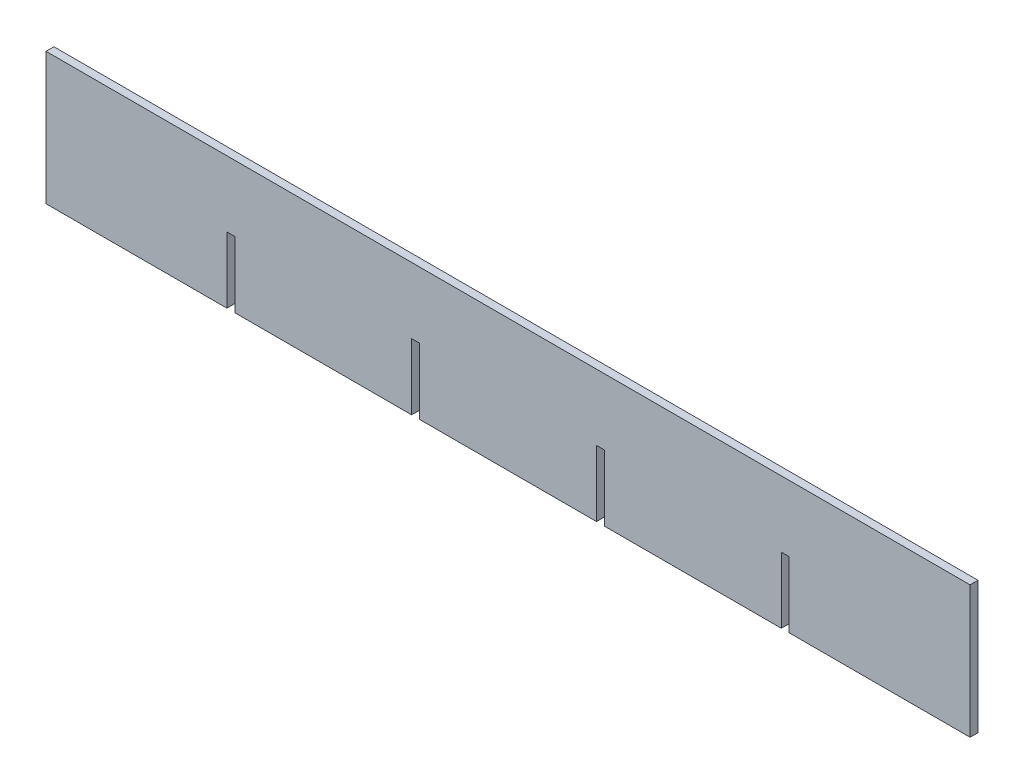
ISO-10303-21;
HEADER;
FILE_DESCRIPTION(('STEP AP214'),'2;1');
FILE_NAME('part.step','',(''),(''),'','','');
FILE_SCHEMA(('AUTOMOTIVE_DESIGN { 1 0 10303 214 1 1 1 1 }'));
ENDSEC;
DATA;
#1=APPLICATION_CONTEXT('core data for automotive mechanical design processes');
#2=APPLICATION_PROTOCOL_DEFINITION('international standard','automotive_design',2000,#1);
#3=PRODUCT_CONTEXT('',#1,'mechanical');
#4=PRODUCT('Part','Part','',(#3));
#5=PRODUCT_RELATED_PRODUCT_CATEGORY('part','',(#4));
#6=PRODUCT_DEFINITION_FORMATION('','',#4);
#7=PRODUCT_DEFINITION_CONTEXT('part definition',#1,'design');
#8=PRODUCT_DEFINITION('design','',#6,#7);
#9=PRODUCT_DEFINITION_SHAPE('','',#8);
#10=(LENGTH_UNIT() NAMED_UNIT(*) SI_UNIT(.MILLI.,.METRE.));
#11=(NAMED_UNIT(*) PLANE_ANGLE_UNIT() SI_UNIT($,.RADIAN.));
#12=(NAMED_UNIT(*) SI_UNIT($,.STERADIAN.) SOLID_ANGLE_UNIT());
#13=UNCERTAINTY_MEASURE_WITH_UNIT(LENGTH_MEASURE(1.E-05),#10,'distance_accuracy_value','');
#14=(GEOMETRIC_REPRESENTATION_CONTEXT(3) GLOBAL_UNCERTAINTY_ASSIGNED_CONTEXT((#13)) GLOBAL_UNIT_ASSIGNED_CONTEXT((#10,
#11,#12)) REPRESENTATION_CONTEXT('',''));
#15=CARTESIAN_POINT('',(0.,0.,0.));
#16=DIRECTION('',(0.,0.,1.));
#17=DIRECTION('',(1.,0.,0.));
#18=AXIS2_PLACEMENT_3D('',#15,#16,#17);
#19=CARTESIAN_POINT('',(281.5,0.,3.));
#20=DIRECTION('',(-1.,0.,0.));
#21=DIRECTION('',(0.,0.,1.));
#22=AXIS2_PLACEMENT_3D('',#19,#20,#21);
#23=PLANE('',#22);
#24=DIRECTION('',(0.,1.,0.));
#25=VECTOR('',#24,1.);
#26=CARTESIAN_POINT('',(281.5,0.,0.));
#27=LINE('',#26,#25);
#28=CARTESIAN_POINT('',(281.5,0.,0.));
#29=VERTEX_POINT('',#28);
#30=CARTESIAN_POINT('',(281.5,25.,0.));
#31=VERTEX_POINT('',#30);
#32=EDGE_CURVE('E206',#29,#31,#27,.T.);
#33=ORIENTED_EDGE('',*,*,#32,.F.);
#34=DIRECTION('',(0.,0.,-1.));
#35=VECTOR('',#34,1.);
#36=CARTESIAN_POINT('',(281.5,0.,3.));
#37=LINE('',#36,#35);
#38=CARTESIAN_POINT('',(281.5,0.,3.));
#39=VERTEX_POINT('',#38);
#40=EDGE_CURVE('E11',#39,#29,#37,.T.);
#41=ORIENTED_EDGE('',*,*,#40,.F.);
#42=DIRECTION('',(0.,1.,0.));
#43=VECTOR('',#42,1.);
#44=CARTESIAN_POINT('',(281.5,0.,3.));
#45=LINE('',#44,#43);
#46=CARTESIAN_POINT('',(281.5,25.,3.));
#47=VERTEX_POINT('',#46);
#48=EDGE_CURVE('E250',#39,#47,#45,.T.);
#49=ORIENTED_EDGE('',*,*,#48,.T.);
#50=DIRECTION('',(0.,0.,-1.));
#51=VECTOR('',#50,1.);
#52=CARTESIAN_POINT('',(281.5,25.,3.));
#53=LINE('',#52,#51);
#54=EDGE_CURVE('E126',#47,#31,#53,.T.);
#55=ORIENTED_EDGE('',*,*,#54,.T.);
#56=EDGE_LOOP('',(#33,#41,#49,#55));
#57=FACE_BOUND('',#56,.T.);
#58=ADVANCED_FACE('F39',(#57),#23,.T.);
#59=CARTESIAN_POINT('',(0.,0.,3.));
#60=DIRECTION('',(0.,1.,0.));
#61=DIRECTION('',(0.,0.,1.));
#62=AXIS2_PLACEMENT_3D('',#59,#60,#61);
#63=PLANE('',#62);
#64=DIRECTION('',(1.,0.,0.));
#65=VECTOR('',#64,1.);
#66=CARTESIAN_POINT('',(0.,0.,0.));
#67=LINE('',#66,#65);
#68=CARTESIAN_POINT('',(350.,0.,0.));
#69=VERTEX_POINT('',#68);
#70=EDGE_CURVE('E209',#29,#69,#67,.T.);
#71=ORIENTED_EDGE('',*,*,#70,.T.);
#72=DIRECTION('',(0.,0.,-1.));
#73=VECTOR('',#72,1.);
#74=CARTESIAN_POINT('',(350.,0.,3.));
#75=LINE('',#74,#73);
#76=CARTESIAN_POINT('',(350.,0.,3.));
#77=VERTEX_POINT('',#76);
#78=EDGE_CURVE('E47',#77,#69,#75,.T.);
#79=ORIENTED_EDGE('',*,*,#78,.F.);
#80=DIRECTION('',(1.,0.,0.));
#81=VECTOR('',#80,1.);
#82=CARTESIAN_POINT('',(0.,0.,3.));
#83=LINE('',#82,#81);
#84=EDGE_CURVE('E192',#39,#77,#83,.T.);
#85=ORIENTED_EDGE('',*,*,#84,.F.);
#86=ORIENTED_EDGE('',*,*,#40,.T.);
#87=EDGE_LOOP('',(#71,#79,#85,#86));
#88=FACE_BOUND('',#87,.T.);
#89=ADVANCED_FACE('F399',(#88),#63,.F.);
#90=CARTESIAN_POINT('',(350.,0.,3.));
#91=DIRECTION('',(-1.,0.,0.));
#92=DIRECTION('',(0.,0.,1.));
#93=AXIS2_PLACEMENT_3D('',#90,#91,#92);
#94=PLANE('',#93);
#95=DIRECTION('',(0.,1.,0.));
#96=VECTOR('',#95,1.);
#97=CARTESIAN_POINT('',(350.,0.,0.));
#98=LINE('',#97,#96);
#99=CARTESIAN_POINT('',(350.,50.,0.));
#100=VERTEX_POINT('',#99);
#101=EDGE_CURVE('E211',#69,#100,#98,.T.);
#102=ORIENTED_EDGE('',*,*,#101,.T.);
#103=DIRECTION('',(0.,0.,-1.));
#104=VECTOR('',#103,1.);
#105=CARTESIAN_POINT('',(350.,50.,3.));
#106=LINE('',#105,#104);
#107=CARTESIAN_POINT('',(350.,50.,3.));
#108=VERTEX_POINT('',#107);
#109=EDGE_CURVE('E286',#108,#100,#106,.T.);
#110=ORIENTED_EDGE('',*,*,#109,.F.);
#111=DIRECTION('',(0.,1.,0.));
#112=VECTOR('',#111,1.);
#113=CARTESIAN_POINT('',(350.,0.,3.));
#114=LINE('',#113,#112);
#115=EDGE_CURVE('E294',#77,#108,#114,.T.);
#116=ORIENTED_EDGE('',*,*,#115,.F.);
#117=ORIENTED_EDGE('',*,*,#78,.T.);
#118=EDGE_LOOP('',(#102,#110,#116,#117));
#119=FACE_BOUND('',#118,.T.);
#120=ADVANCED_FACE('F292',(#119),#94,.F.);
#121=CARTESIAN_POINT('',(0.,50.,3.));
#122=DIRECTION('',(0.,1.,0.));
#123=DIRECTION('',(0.,0.,1.));
#124=AXIS2_PLACEMENT_3D('',#121,#122,#123);
#125=PLANE('',#124);
#126=DIRECTION('',(1.,0.,0.));
#127=VECTOR('',#126,1.);
#128=CARTESIAN_POINT('',(0.,50.,0.));
#129=LINE('',#128,#127);
#130=CARTESIAN_POINT('',(0.,50.,0.));
#131=VERTEX_POINT('',#130);
#132=EDGE_CURVE('E215',#131,#100,#129,.T.);
#133=ORIENTED_EDGE('',*,*,#132,.F.);
#134=DIRECTION('',(0.,0.,-1.));
#135=VECTOR('',#134,1.);
#136=CARTESIAN_POINT('',(0.,50.,3.));
#137=LINE('',#136,#135);
#138=CARTESIAN_POINT('',(0.,50.,3.));
#139=VERTEX_POINT('',#138);
#140=EDGE_CURVE('E284',#139,#131,#137,.T.);
#141=ORIENTED_EDGE('',*,*,#140,.F.);
#142=DIRECTION('',(1.,0.,0.));
#143=VECTOR('',#142,1.);
#144=CARTESIAN_POINT('',(0.,50.,3.));
#145=LINE('',#144,#143);
#146=EDGE_CURVE('E306',#139,#108,#145,.T.);
#147=ORIENTED_EDGE('',*,*,#146,.T.);
#148=ORIENTED_EDGE('',*,*,#109,.T.);
#149=EDGE_LOOP('',(#133,#141,#147,#148));
#150=FACE_BOUND('',#149,.T.);
#151=ADVANCED_FACE('F303',(#150),#125,.T.);
#152=CARTESIAN_POINT('',(0.,0.,3.));
#153=DIRECTION('',(-1.,0.,0.));
#154=DIRECTION('',(0.,0.,1.));
#155=AXIS2_PLACEMENT_3D('',#152,#153,#154);
#156=PLANE('',#155);
#157=DIRECTION('',(0.,1.,0.));
#158=VECTOR('',#157,1.);
#159=CARTESIAN_POINT('',(0.,0.,0.));
#160=LINE('',#159,#158);
#161=CARTESIAN_POINT('',(0.,0.,0.));
#162=VERTEX_POINT('',#161);
#163=EDGE_CURVE('E218',#162,#131,#160,.T.);
#164=ORIENTED_EDGE('',*,*,#163,.F.);
#165=DIRECTION('',(0.,0.,-1.));
#166=VECTOR('',#165,1.);
#167=CARTESIAN_POINT('',(0.,0.,3.));
#168=LINE('',#167,#166);
#169=CARTESIAN_POINT('',(0.,0.,3.));
#170=VERTEX_POINT('',#169);
#171=EDGE_CURVE('E282',#170,#162,#168,.T.);
#172=ORIENTED_EDGE('',*,*,#171,.F.);
#173=DIRECTION('',(0.,1.,0.));
#174=VECTOR('',#173,1.);
#175=CARTESIAN_POINT('',(0.,0.,3.));
#176=LINE('',#175,#174);
#177=EDGE_CURVE('E309',#170,#139,#176,.T.);
#178=ORIENTED_EDGE('',*,*,#177,.T.);
#179=ORIENTED_EDGE('',*,*,#140,.T.);
#180=EDGE_LOOP('',(#164,#172,#178,#179));
#181=FACE_BOUND('',#180,.T.);
#182=ADVANCED_FACE('F587',(#181),#156,.T.);
#183=CARTESIAN_POINT('',(68.5,0.,0.));
#184=VERTEX_POINT('',#183);
#185=EDGE_CURVE('E212',#162,#184,#67,.T.);
#186=ORIENTED_EDGE('',*,*,#185,.T.);
#187=DIRECTION('',(0.,0.,-1.));
#188=VECTOR('',#187,1.);
#189=CARTESIAN_POINT('',(68.5,0.,3.));
#190=LINE('',#189,#188);
#191=CARTESIAN_POINT('',(68.5,0.,3.));
#192=VERTEX_POINT('',#191);
#193=EDGE_CURVE('E279',#192,#184,#190,.T.);
#194=ORIENTED_EDGE('',*,*,#193,.F.);
#195=EDGE_CURVE('E311',#170,#192,#83,.T.);
#196=ORIENTED_EDGE('',*,*,#195,.F.);
#197=ORIENTED_EDGE('',*,*,#171,.T.);
#198=EDGE_LOOP('',(#186,#194,#196,#197));
#199=FACE_BOUND('',#198,.T.);
#200=ADVANCED_FACE('F347',(#199),#63,.F.);
#201=CARTESIAN_POINT('',(68.5,0.,3.));
#202=DIRECTION('',(-1.,0.,0.));
#203=DIRECTION('',(0.,0.,1.));
#204=AXIS2_PLACEMENT_3D('',#201,#202,#203);
#205=PLANE('',#204);
#206=DIRECTION('',(0.,1.,0.));
#207=VECTOR('',#206,1.);
#208=CARTESIAN_POINT('',(68.5,0.,0.));
#209=LINE('',#208,#207);
#210=CARTESIAN_POINT('',(68.5,25.,0.));
#211=VERTEX_POINT('',#210);
#212=EDGE_CURVE('E221',#184,#211,#209,.T.);
#213=ORIENTED_EDGE('',*,*,#212,.T.);
#214=DIRECTION('',(0.,0.,-1.));
#215=VECTOR('',#214,1.);
#216=CARTESIAN_POINT('',(68.5,25.,3.));
#217=LINE('',#216,#215);
#218=CARTESIAN_POINT('',(68.5,25.,3.));
#219=VERTEX_POINT('',#218);
#220=EDGE_CURVE('E276',#219,#211,#217,.T.);
#221=ORIENTED_EDGE('',*,*,#220,.F.);
#222=DIRECTION('',(0.,1.,0.));
#223=VECTOR('',#222,1.);
#224=CARTESIAN_POINT('',(68.5,0.,3.));
#225=LINE('',#224,#223);
#226=EDGE_CURVE('E315',#192,#219,#225,.T.);
#227=ORIENTED_EDGE('',*,*,#226,.F.);
#228=ORIENTED_EDGE('',*,*,#193,.T.);
#229=EDGE_LOOP('',(#213,#221,#227,#228));
#230=FACE_BOUND('',#229,.T.);
#231=ADVANCED_FACE('F352',(#230),#205,.F.);
#232=CARTESIAN_POINT('',(0.,25.,3.));
#233=DIRECTION('',(0.,1.,0.));
#234=DIRECTION('',(0.,0.,1.));
#235=AXIS2_PLACEMENT_3D('',#232,#233,#234);
#236=PLANE('',#235);
#237=DIRECTION('',(1.,0.,0.));
#238=VECTOR('',#237,1.);
#239=CARTESIAN_POINT('',(0.,25.,0.));
#240=LINE('',#239,#238);
#241=CARTESIAN_POINT('',(71.5,25.,0.));
#242=VERTEX_POINT('',#241);
#243=EDGE_CURVE('E223',#211,#242,#240,.T.);
#244=ORIENTED_EDGE('',*,*,#243,.T.);
#245=DIRECTION('',(0.,0.,-1.));
#246=VECTOR('',#245,1.);
#247=CARTESIAN_POINT('',(71.5,25.,3.));
#248=LINE('',#247,#246);
#249=CARTESIAN_POINT('',(71.5,25.,3.));
#250=VERTEX_POINT('',#249);
#251=EDGE_CURVE('E274',#250,#242,#248,.T.);
#252=ORIENTED_EDGE('',*,*,#251,.F.);
#253=DIRECTION('',(1.,0.,0.));
#254=VECTOR('',#253,1.);
#255=CARTESIAN_POINT('',(0.,25.,3.));
#256=LINE('',#255,#254);
#257=EDGE_CURVE('E317',#219,#250,#256,.T.);
#258=ORIENTED_EDGE('',*,*,#257,.F.);
#259=ORIENTED_EDGE('',*,*,#220,.T.);
#260=EDGE_LOOP('',(#244,#252,#258,#259));
#261=FACE_BOUND('',#260,.T.);
#262=ADVANCED_FACE('F358',(#261),#236,.F.);
#263=CARTESIAN_POINT('',(71.5,0.,3.));
#264=DIRECTION('',(-1.,0.,0.));
#265=DIRECTION('',(0.,-1.,0.));
#266=AXIS2_PLACEMENT_3D('',#263,#264,#265);
#267=PLANE('',#266);
#268=DIRECTION('',(0.,1.,0.));
#269=VECTOR('',#268,1.);
#270=CARTESIAN_POINT('',(71.5,0.,0.));
#271=LINE('',#270,#269);
#272=CARTESIAN_POINT('',(71.5,0.,0.));
#273=VERTEX_POINT('',#272);
#274=EDGE_CURVE('E226',#273,#242,#271,.T.);
#275=ORIENTED_EDGE('',*,*,#274,.F.);
#276=DIRECTION('',(0.,0.,-1.));
#277=VECTOR('',#276,1.);
#278=CARTESIAN_POINT('',(71.5,0.,3.));
#279=LINE('',#278,#277);
#280=CARTESIAN_POINT('',(71.5,0.,3.));
#281=VERTEX_POINT('',#280);
#282=EDGE_CURVE('E272',#281,#273,#279,.T.);
#283=ORIENTED_EDGE('',*,*,#282,.F.);
#284=DIRECTION('',(0.,1.,0.));
#285=VECTOR('',#284,1.);
#286=CARTESIAN_POINT('',(71.5,0.,3.));
#287=LINE('',#286,#285);
#288=EDGE_CURVE('E319',#281,#250,#287,.T.);
#289=ORIENTED_EDGE('',*,*,#288,.T.);
#290=ORIENTED_EDGE('',*,*,#251,.T.);
#291=EDGE_LOOP('',(#275,#283,#289,#290));
#292=FACE_BOUND('',#291,.T.);
#293=ADVANCED_FACE('F388',(#292),#267,.T.);
#294=CARTESIAN_POINT('',(138.5,0.,0.));
#295=VERTEX_POINT('',#294);
#296=EDGE_CURVE('E229',#273,#295,#67,.T.);
#297=ORIENTED_EDGE('',*,*,#296,.T.);
#298=DIRECTION('',(0.,0.,-1.));
#299=VECTOR('',#298,1.);
#300=CARTESIAN_POINT('',(138.5,0.,3.));
#301=LINE('',#300,#299);
#302=CARTESIAN_POINT('',(138.5,0.,3.));
#303=VERTEX_POINT('',#302);
#304=EDGE_CURVE('E269',#303,#295,#301,.T.);
#305=ORIENTED_EDGE('',*,*,#304,.F.);
#306=EDGE_CURVE('E322',#281,#303,#83,.T.);
#307=ORIENTED_EDGE('',*,*,#306,.F.);
#308=ORIENTED_EDGE('',*,*,#282,.T.);
#309=EDGE_LOOP('',(#297,#305,#307,#308));
#310=FACE_BOUND('',#309,.T.);
#311=ADVANCED_FACE('F386',(#310),#63,.F.);
#312=CARTESIAN_POINT('',(138.5,0.,3.));
#313=DIRECTION('',(-1.,0.,0.));
#314=DIRECTION('',(0.,0.,1.));
#315=AXIS2_PLACEMENT_3D('',#312,#313,#314);
#316=PLANE('',#315);
#317=DIRECTION('',(0.,1.,0.));
#318=VECTOR('',#317,1.);
#319=CARTESIAN_POINT('',(138.5,0.,0.));
#320=LINE('',#319,#318);
#321=CARTESIAN_POINT('',(138.5,25.,0.));
#322=VERTEX_POINT('',#321);
#323=EDGE_CURVE('E230',#295,#322,#320,.T.);
#324=ORIENTED_EDGE('',*,*,#323,.T.);
#325=DIRECTION('',(0.,0.,-1.));
#326=VECTOR('',#325,1.);
#327=CARTESIAN_POINT('',(138.5,25.,3.));
#328=LINE('',#327,#326);
#329=CARTESIAN_POINT('',(138.5,25.,3.));
#330=VERTEX_POINT('',#329);
#331=EDGE_CURVE('E266',#330,#322,#328,.T.);
#332=ORIENTED_EDGE('',*,*,#331,.F.);
#333=DIRECTION('',(0.,1.,0.));
#334=VECTOR('',#333,1.);
#335=CARTESIAN_POINT('',(138.5,0.,3.));
#336=LINE('',#335,#334);
#337=EDGE_CURVE('E323',#303,#330,#336,.T.);
#338=ORIENTED_EDGE('',*,*,#337,.F.);
#339=ORIENTED_EDGE('',*,*,#304,.T.);
#340=EDGE_LOOP('',(#324,#332,#338,#339));
#341=FACE_BOUND('',#340,.T.);
#342=ADVANCED_FACE('F384',(#341),#316,.F.);
#343=CARTESIAN_POINT('',(0.,25.,3.));
#344=DIRECTION('',(0.,1.,0.));
#345=DIRECTION('',(0.,0.,1.));
#346=AXIS2_PLACEMENT_3D('',#343,#344,#345);
#347=PLANE('',#346);
#348=DIRECTION('',(1.,0.,0.));
#349=VECTOR('',#348,1.);
#350=CARTESIAN_POINT('',(0.,25.,0.));
#351=LINE('',#350,#349);
#352=CARTESIAN_POINT('',(141.5,25.,0.));
#353=VERTEX_POINT('',#352);
#354=EDGE_CURVE('E232',#322,#353,#351,.T.);
#355=ORIENTED_EDGE('',*,*,#354,.T.);
#356=DIRECTION('',(0.,0.,-1.));
#357=VECTOR('',#356,1.);
#358=CARTESIAN_POINT('',(141.5,25.,3.));
#359=LINE('',#358,#357);
#360=CARTESIAN_POINT('',(141.5,25.,3.));
#361=VERTEX_POINT('',#360);
#362=EDGE_CURVE('E264',#361,#353,#359,.T.);
#363=ORIENTED_EDGE('',*,*,#362,.F.);
#364=DIRECTION('',(1.,0.,0.));
#365=VECTOR('',#364,1.);
#366=CARTESIAN_POINT('',(0.,25.,3.));
#367=LINE('',#366,#365);
#368=EDGE_CURVE('E325',#330,#361,#367,.T.);
#369=ORIENTED_EDGE('',*,*,#368,.F.);
#370=ORIENTED_EDGE('',*,*,#331,.T.);
#371=EDGE_LOOP('',(#355,#363,#369,#370));
#372=FACE_BOUND('',#371,.T.);
#373=ADVANCED_FACE('F380',(#372),#347,.F.);
#374=CARTESIAN_POINT('',(141.5,0.,3.));
#375=DIRECTION('',(-1.,0.,0.));
#376=DIRECTION('',(0.,0.,1.));
#377=AXIS2_PLACEMENT_3D('',#374,#375,#376);
#378=PLANE('',#377);
#379=DIRECTION('',(0.,1.,0.));
#380=VECTOR('',#379,1.);
#381=CARTESIAN_POINT('',(141.5,0.,0.));
#382=LINE('',#381,#380);
#383=CARTESIAN_POINT('',(141.5,0.,0.));
#384=VERTEX_POINT('',#383);
#385=EDGE_CURVE('E235',#384,#353,#382,.T.);
#386=ORIENTED_EDGE('',*,*,#385,.F.);
#387=DIRECTION('',(0.,0.,-1.));
#388=VECTOR('',#387,1.);
#389=CARTESIAN_POINT('',(141.5,0.,3.));
#390=LINE('',#389,#388);
#391=CARTESIAN_POINT('',(141.5,0.,3.));
#392=VERTEX_POINT('',#391);
#393=EDGE_CURVE('E262',#392,#384,#390,.T.);
#394=ORIENTED_EDGE('',*,*,#393,.F.);
#395=DIRECTION('',(0.,1.,0.));
#396=VECTOR('',#395,1.);
#397=CARTESIAN_POINT('',(141.5,0.,3.));
#398=LINE('',#397,#396);
#399=EDGE_CURVE('E327',#392,#361,#398,.T.);
#400=ORIENTED_EDGE('',*,*,#399,.T.);
#401=ORIENTED_EDGE('',*,*,#362,.T.);
#402=EDGE_LOOP('',(#386,#394,#400,#401));
#403=FACE_BOUND('',#402,.T.);
#404=ADVANCED_FACE('F376',(#403),#378,.T.);
#405=CARTESIAN_POINT('',(208.5,0.,0.));
#406=VERTEX_POINT('',#405);
#407=EDGE_CURVE('E238',#384,#406,#67,.T.);
#408=ORIENTED_EDGE('',*,*,#407,.T.);
#409=DIRECTION('',(0.,0.,-1.));
#410=VECTOR('',#409,1.);
#411=CARTESIAN_POINT('',(208.5,0.,3.));
#412=LINE('',#411,#410);
#413=CARTESIAN_POINT('',(208.5,0.,3.));
#414=VERTEX_POINT('',#413);
#415=EDGE_CURVE('E259',#414,#406,#412,.T.);
#416=ORIENTED_EDGE('',*,*,#415,.F.);
#417=EDGE_CURVE('E191',#392,#414,#83,.T.);
#418=ORIENTED_EDGE('',*,*,#417,.F.);
#419=ORIENTED_EDGE('',*,*,#393,.T.);
#420=EDGE_LOOP('',(#408,#416,#418,#419));
#421=FACE_BOUND('',#420,.T.);
#422=ADVANCED_FACE('F367',(#421),#63,.F.);
#423=CARTESIAN_POINT('',(208.5,0.,3.));
#424=DIRECTION('',(-1.,0.,0.));
#425=DIRECTION('',(0.,0.,1.));
#426=AXIS2_PLACEMENT_3D('',#423,#424,#425);
#427=PLANE('',#426);
#428=DIRECTION('',(0.,1.,0.));
#429=VECTOR('',#428,1.);
#430=CARTESIAN_POINT('',(208.5,0.,0.));
#431=LINE('',#430,#429);
#432=CARTESIAN_POINT('',(208.5,25.,0.));
#433=VERTEX_POINT('',#432);
#434=EDGE_CURVE('E239',#406,#433,#431,.T.);
#435=ORIENTED_EDGE('',*,*,#434,.T.);
#436=DIRECTION('',(0.,0.,-1.));
#437=VECTOR('',#436,1.);
#438=CARTESIAN_POINT('',(208.5,25.,3.));
#439=LINE('',#438,#437);
#440=CARTESIAN_POINT('',(208.5,25.,3.));
#441=VERTEX_POINT('',#440);
#442=EDGE_CURVE('E256',#441,#433,#439,.T.);
#443=ORIENTED_EDGE('',*,*,#442,.F.);
#444=DIRECTION('',(0.,1.,0.));
#445=VECTOR('',#444,1.);
#446=CARTESIAN_POINT('',(208.5,0.,3.));
#447=LINE('',#446,#445);
#448=EDGE_CURVE('E330',#414,#441,#447,.T.);
#449=ORIENTED_EDGE('',*,*,#448,.F.);
#450=ORIENTED_EDGE('',*,*,#415,.T.);
#451=EDGE_LOOP('',(#435,#443,#449,#450));
#452=FACE_BOUND('',#451,.T.);
#453=ADVANCED_FACE('F370',(#452),#427,.F.);
#454=CARTESIAN_POINT('',(0.,25.,3.));
#455=DIRECTION('',(0.,1.,0.));
#456=DIRECTION('',(0.,0.,1.));
#457=AXIS2_PLACEMENT_3D('',#454,#455,#456);
#458=PLANE('',#457);
#459=DIRECTION('',(1.,0.,0.));
#460=VECTOR('',#459,1.);
#461=CARTESIAN_POINT('',(0.,25.,0.));
#462=LINE('',#461,#460);
#463=CARTESIAN_POINT('',(211.5,25.,0.));
#464=VERTEX_POINT('',#463);
#465=EDGE_CURVE('E241',#433,#464,#462,.T.);
#466=ORIENTED_EDGE('',*,*,#465,.T.);
#467=DIRECTION('',(0.,0.,-1.));
#468=VECTOR('',#467,1.);
#469=CARTESIAN_POINT('',(211.5,25.,3.));
#470=LINE('',#469,#468);
#471=CARTESIAN_POINT('',(211.5,25.,3.));
#472=VERTEX_POINT('',#471);
#473=EDGE_CURVE('E254',#472,#464,#470,.T.);
#474=ORIENTED_EDGE('',*,*,#473,.F.);
#475=DIRECTION('',(1.,0.,0.));
#476=VECTOR('',#475,1.);
#477=CARTESIAN_POINT('',(0.,25.,3.));
#478=LINE('',#477,#476);
#479=EDGE_CURVE('E331',#441,#472,#478,.T.);
#480=ORIENTED_EDGE('',*,*,#479,.F.);
#481=ORIENTED_EDGE('',*,*,#442,.T.);
#482=EDGE_LOOP('',(#466,#474,#480,#481));
#483=FACE_BOUND('',#482,.T.);
#484=ADVANCED_FACE('F372',(#483),#458,.F.);
#485=CARTESIAN_POINT('',(211.5,0.,3.));
#486=DIRECTION('',(-1.,0.,0.));
#487=DIRECTION('',(0.,0.,1.));
#488=AXIS2_PLACEMENT_3D('',#485,#486,#487);
#489=PLANE('',#488);
#490=DIRECTION('',(0.,1.,0.));
#491=VECTOR('',#490,1.);
#492=CARTESIAN_POINT('',(211.5,0.,0.));
#493=LINE('',#492,#491);
#494=CARTESIAN_POINT('',(211.5,0.,0.));
#495=VERTEX_POINT('',#494);
#496=EDGE_CURVE('E244',#495,#464,#493,.T.);
#497=ORIENTED_EDGE('',*,*,#496,.F.);
#498=DIRECTION('',(0.,0.,-1.));
#499=VECTOR('',#498,1.);
#500=CARTESIAN_POINT('',(211.5,0.,3.));
#501=LINE('',#500,#499);
#502=CARTESIAN_POINT('',(211.5,0.,3.));
#503=VERTEX_POINT('',#502);
#504=EDGE_CURVE('E197',#503,#495,#501,.T.);
#505=ORIENTED_EDGE('',*,*,#504,.F.);
#506=DIRECTION('',(0.,1.,0.));
#507=VECTOR('',#506,1.);
#508=CARTESIAN_POINT('',(211.5,0.,3.));
#509=LINE('',#508,#507);
#510=EDGE_CURVE('E188',#503,#472,#509,.T.);
#511=ORIENTED_EDGE('',*,*,#510,.T.);
#512=ORIENTED_EDGE('',*,*,#473,.T.);
#513=EDGE_LOOP('',(#497,#505,#511,#512));
#514=FACE_BOUND('',#513,.T.);
#515=ADVANCED_FACE('F336',(#514),#489,.T.);
#516=CARTESIAN_POINT('',(278.5,0.,0.));
#517=VERTEX_POINT('',#516);
#518=EDGE_CURVE('E196',#495,#517,#67,.T.);
#519=ORIENTED_EDGE('',*,*,#518,.T.);
#520=DIRECTION('',(0.,0.,-1.));
#521=VECTOR('',#520,1.);
#522=CARTESIAN_POINT('',(278.5,0.,3.));
#523=LINE('',#522,#521);
#524=CARTESIAN_POINT('',(278.5,0.,3.));
#525=VERTEX_POINT('',#524);
#526=EDGE_CURVE('E193',#525,#517,#523,.T.);
#527=ORIENTED_EDGE('',*,*,#526,.F.);
#528=EDGE_CURVE('E182',#503,#525,#83,.T.);
#529=ORIENTED_EDGE('',*,*,#528,.F.);
#530=ORIENTED_EDGE('',*,*,#504,.T.);
#531=EDGE_LOOP('',(#519,#527,#529,#530));
#532=FACE_BOUND('',#531,.T.);
#533=ADVANCED_FACE('F194',(#532),#63,.F.);
#534=CARTESIAN_POINT('',(278.5,0.,3.));
#535=DIRECTION('',(-1.,0.,0.));
#536=DIRECTION('',(0.,0.,1.));
#537=AXIS2_PLACEMENT_3D('',#534,#535,#536);
#538=PLANE('',#537);
#539=DIRECTION('',(0.,1.,0.));
#540=VECTOR('',#539,1.);
#541=CARTESIAN_POINT('',(278.5,0.,0.));
#542=LINE('',#541,#540);
#543=CARTESIAN_POINT('',(278.5,25.,0.));
#544=VERTEX_POINT('',#543);
#545=EDGE_CURVE('E119',#517,#544,#542,.T.);
#546=ORIENTED_EDGE('',*,*,#545,.T.);
#547=DIRECTION('',(0.,0.,-1.));
#548=VECTOR('',#547,1.);
#549=CARTESIAN_POINT('',(278.5,25.,3.));
#550=LINE('',#549,#548);
#551=CARTESIAN_POINT('',(278.5,25.,3.));
#552=VERTEX_POINT('',#551);
#553=EDGE_CURVE('E198',#552,#544,#550,.T.);
#554=ORIENTED_EDGE('',*,*,#553,.F.);
#555=DIRECTION('',(0.,1.,0.));
#556=VECTOR('',#555,1.);
#557=CARTESIAN_POINT('',(278.5,0.,3.));
#558=LINE('',#557,#556);
#559=EDGE_CURVE('E186',#525,#552,#558,.T.);
#560=ORIENTED_EDGE('',*,*,#559,.F.);
#561=ORIENTED_EDGE('',*,*,#526,.T.);
#562=EDGE_LOOP('',(#546,#554,#560,#561));
#563=FACE_BOUND('',#562,.T.);
#564=ADVANCED_FACE('F200',(#563),#538,.F.);
#565=CARTESIAN_POINT('',(0.,25.,3.));
#566=DIRECTION('',(0.,1.,0.));
#567=DIRECTION('',(0.,0.,1.));
#568=AXIS2_PLACEMENT_3D('',#565,#566,#567);
#569=PLANE('',#568);
#570=DIRECTION('',(1.,0.,0.));
#571=VECTOR('',#570,1.);
#572=CARTESIAN_POINT('',(0.,25.,0.));
#573=LINE('',#572,#571);
#574=EDGE_CURVE('E248',#544,#31,#573,.T.);
#575=ORIENTED_EDGE('',*,*,#574,.T.);
#576=ORIENTED_EDGE('',*,*,#54,.F.);
#577=DIRECTION('',(1.,0.,0.));
#578=VECTOR('',#577,1.);
#579=CARTESIAN_POINT('',(0.,25.,3.));
#580=LINE('',#579,#578);
#581=EDGE_CURVE('E55',#552,#47,#580,.T.);
#582=ORIENTED_EDGE('',*,*,#581,.F.);
#583=ORIENTED_EDGE('',*,*,#553,.T.);
#584=EDGE_LOOP('',(#575,#576,#582,#583));
#585=FACE_BOUND('',#584,.T.);
#586=ADVANCED_FACE('F404',(#585),#569,.F.);
#587=CARTESIAN_POINT('',(0.,0.,3.));
#588=DIRECTION('',(0.,0.,1.));
#589=DIRECTION('',(1.,0.,0.));
#590=AXIS2_PLACEMENT_3D('',#587,#588,#589);
#591=PLANE('',#590);
#592=ORIENTED_EDGE('',*,*,#48,.F.);
#593=ORIENTED_EDGE('',*,*,#84,.T.);
#594=ORIENTED_EDGE('',*,*,#115,.T.);
#595=ORIENTED_EDGE('',*,*,#146,.F.);
#596=ORIENTED_EDGE('',*,*,#177,.F.);
#597=ORIENTED_EDGE('',*,*,#195,.T.);
#598=ORIENTED_EDGE('',*,*,#226,.T.);
#599=ORIENTED_EDGE('',*,*,#257,.T.);
#600=ORIENTED_EDGE('',*,*,#288,.F.);
#601=ORIENTED_EDGE('',*,*,#306,.T.);
#602=ORIENTED_EDGE('',*,*,#337,.T.);
#603=ORIENTED_EDGE('',*,*,#368,.T.);
#604=ORIENTED_EDGE('',*,*,#399,.F.);
#605=ORIENTED_EDGE('',*,*,#417,.T.);
#606=ORIENTED_EDGE('',*,*,#448,.T.);
#607=ORIENTED_EDGE('',*,*,#479,.T.);
#608=ORIENTED_EDGE('',*,*,#510,.F.);
#609=ORIENTED_EDGE('',*,*,#528,.T.);
#610=ORIENTED_EDGE('',*,*,#559,.T.);
#611=ORIENTED_EDGE('',*,*,#581,.T.);
#612=EDGE_LOOP('',(#592,#593,#594,#595,#596,#597,#598,#599,#600,#601,#602,#603,#604,#605,#606,
#607,#608,#609,#610,#611));
#613=FACE_BOUND('',#612,.T.);
#614=ADVANCED_FACE('F184',(#613),#591,.T.);
#615=CARTESIAN_POINT('',(0.,0.,0.));
#616=DIRECTION('',(0.,0.,1.));
#617=DIRECTION('',(1.,0.,0.));
#618=AXIS2_PLACEMENT_3D('',#615,#616,#617);
#619=PLANE('',#618);
#620=ORIENTED_EDGE('',*,*,#32,.T.);
#621=ORIENTED_EDGE('',*,*,#574,.F.);
#622=ORIENTED_EDGE('',*,*,#545,.F.);
#623=ORIENTED_EDGE('',*,*,#518,.F.);
#624=ORIENTED_EDGE('',*,*,#496,.T.);
#625=ORIENTED_EDGE('',*,*,#465,.F.);
#626=ORIENTED_EDGE('',*,*,#434,.F.);
#627=ORIENTED_EDGE('',*,*,#407,.F.);
#628=ORIENTED_EDGE('',*,*,#385,.T.);
#629=ORIENTED_EDGE('',*,*,#354,.F.);
#630=ORIENTED_EDGE('',*,*,#323,.F.);
#631=ORIENTED_EDGE('',*,*,#296,.F.);
#632=ORIENTED_EDGE('',*,*,#274,.T.);
#633=ORIENTED_EDGE('',*,*,#243,.F.);
#634=ORIENTED_EDGE('',*,*,#212,.F.);
#635=ORIENTED_EDGE('',*,*,#185,.F.);
#636=ORIENTED_EDGE('',*,*,#163,.T.);
#637=ORIENTED_EDGE('',*,*,#132,.T.);
#638=ORIENTED_EDGE('',*,*,#101,.F.);
#639=ORIENTED_EDGE('',*,*,#70,.F.);
#640=EDGE_LOOP('',(#620,#621,#622,#623,#624,#625,#626,#627,#628,#629,#630,#631,#632,#633,#634,
#635,#636,#637,#638,#639));
#641=FACE_BOUND('',#640,.T.);
#642=ADVANCED_FACE('F298',(#641),#619,.F.);
#643=CLOSED_SHELL('',(#58,#89,#120,#151,#182,#200,#231,#262,#293,#311,#342,#373,#404,#422,#453,
#484,#515,#533,#564,#586,#614,#642));
#644=MANIFOLD_SOLID_BREP('B2',#643);
#645=ADVANCED_BREP_SHAPE_REPRESENTATION('',(#18,#644),#14);
#646=SHAPE_DEFINITION_REPRESENTATION(#9,#645);
ENDSEC;
END-ISO-10303-21;
